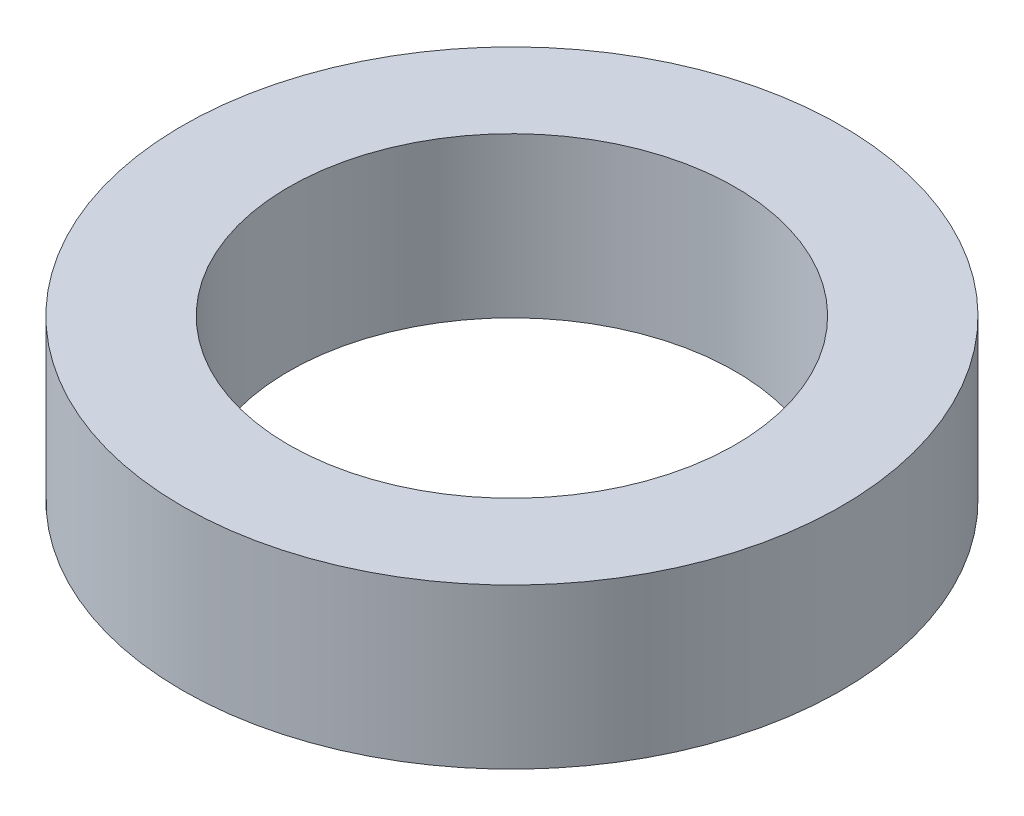
ISO-10303-21;
HEADER;
FILE_DESCRIPTION(('STEP AP214'),'2;1');
FILE_NAME('part.step','',(''),(''),'','','');
FILE_SCHEMA(('AUTOMOTIVE_DESIGN { 1 0 10303 214 1 1 1 1 }'));
ENDSEC;
DATA;
#1=APPLICATION_CONTEXT('core data for automotive mechanical design processes');
#2=APPLICATION_PROTOCOL_DEFINITION('international standard','automotive_design',2000,#1);
#3=PRODUCT_CONTEXT('',#1,'mechanical');
#4=PRODUCT('Part','Part','',(#3));
#5=PRODUCT_RELATED_PRODUCT_CATEGORY('part','',(#4));
#6=PRODUCT_DEFINITION_FORMATION('','',#4);
#7=PRODUCT_DEFINITION_CONTEXT('part definition',#1,'design');
#8=PRODUCT_DEFINITION('design','',#6,#7);
#9=PRODUCT_DEFINITION_SHAPE('','',#8);
#10=(LENGTH_UNIT() NAMED_UNIT(*) SI_UNIT(.MILLI.,.METRE.));
#11=(NAMED_UNIT(*) PLANE_ANGLE_UNIT() SI_UNIT($,.RADIAN.));
#12=(NAMED_UNIT(*) SI_UNIT($,.STERADIAN.) SOLID_ANGLE_UNIT());
#13=UNCERTAINTY_MEASURE_WITH_UNIT(LENGTH_MEASURE(1.E-05),#10,'distance_accuracy_value','');
#14=(GEOMETRIC_REPRESENTATION_CONTEXT(3) GLOBAL_UNCERTAINTY_ASSIGNED_CONTEXT((#13)) GLOBAL_UNIT_ASSIGNED_CONTEXT((#10,
#11,#12)) REPRESENTATION_CONTEXT('',''));
#15=CARTESIAN_POINT('',(0.,0.,0.));
#16=DIRECTION('',(0.,0.,1.));
#17=DIRECTION('',(1.,0.,0.));
#18=AXIS2_PLACEMENT_3D('',#15,#16,#17);
#19=CARTESIAN_POINT('',(0.,1.5,0.));
#20=DIRECTION('',(0.,1.,0.));
#21=DIRECTION('',(0.,0.,1.));
#22=AXIS2_PLACEMENT_3D('',#19,#20,#21);
#23=PLANE('',#22);
#24=CARTESIAN_POINT('',(0.,1.5,0.));
#25=DIRECTION('',(0.,1.,0.));
#26=DIRECTION('',(0.,0.,1.));
#27=AXIS2_PLACEMENT_3D('',#24,#25,#26);
#28=CIRCLE('',#27,3.1);
#29=CARTESIAN_POINT('',(0.,1.5,3.1));
#30=VERTEX_POINT('',#29);
#31=EDGE_CURVE('E10',#30,#30,#28,.T.);
#32=ORIENTED_EDGE('',*,*,#31,.T.);
#33=EDGE_LOOP('',(#32));
#34=FACE_BOUND('',#33,.T.);
#35=CARTESIAN_POINT('',(0.,1.5,0.));
#36=DIRECTION('',(0.,1.,0.));
#37=DIRECTION('',(0.,0.,1.));
#38=AXIS2_PLACEMENT_3D('',#35,#36,#37);
#39=CIRCLE('',#38,2.1);
#40=CARTESIAN_POINT('',(0.,1.5,2.1));
#41=VERTEX_POINT('',#40);
#42=EDGE_CURVE('E44',#41,#41,#39,.T.);
#43=ORIENTED_EDGE('',*,*,#42,.F.);
#44=EDGE_LOOP('',(#43));
#45=FACE_BOUND('',#44,.T.);
#46=ADVANCED_FACE('F33',(#34,#45),#23,.T.);
#47=CARTESIAN_POINT('',(0.,0.,0.));
#48=DIRECTION('',(0.,1.,0.));
#49=DIRECTION('',(0.,0.,1.));
#50=AXIS2_PLACEMENT_3D('',#47,#48,#49);
#51=PLANE('',#50);
#52=CARTESIAN_POINT('',(0.,0.,0.));
#53=DIRECTION('',(0.,1.,0.));
#54=DIRECTION('',(0.,0.,1.));
#55=AXIS2_PLACEMENT_3D('',#52,#53,#54);
#56=CIRCLE('',#55,3.1);
#57=CARTESIAN_POINT('',(0.,0.,3.1));
#58=VERTEX_POINT('',#57);
#59=EDGE_CURVE('E37',#58,#58,#56,.T.);
#60=ORIENTED_EDGE('',*,*,#59,.F.);
#61=EDGE_LOOP('',(#60));
#62=FACE_BOUND('',#61,.T.);
#63=CARTESIAN_POINT('',(0.,0.,0.));
#64=DIRECTION('',(0.,1.,0.));
#65=DIRECTION('',(0.,0.,1.));
#66=AXIS2_PLACEMENT_3D('',#63,#64,#65);
#67=CIRCLE('',#66,2.1);
#68=CARTESIAN_POINT('',(0.,0.,2.1));
#69=VERTEX_POINT('',#68);
#70=EDGE_CURVE('E46',#69,#69,#67,.T.);
#71=ORIENTED_EDGE('',*,*,#70,.T.);
#72=EDGE_LOOP('',(#71));
#73=FACE_BOUND('',#72,.T.);
#74=ADVANCED_FACE('F56',(#62,#73),#51,.F.);
#75=CARTESIAN_POINT('',(0.,1.5,0.));
#76=DIRECTION('',(0.,-1.,0.));
#77=DIRECTION('',(0.,0.,-1.));
#78=AXIS2_PLACEMENT_3D('',#75,#76,#77);
#79=CYLINDRICAL_SURFACE('',#78,3.1);
#80=ORIENTED_EDGE('',*,*,#31,.F.);
#81=EDGE_LOOP('',(#80));
#82=FACE_BOUND('',#81,.T.);
#83=ORIENTED_EDGE('',*,*,#59,.T.);
#84=EDGE_LOOP('',(#83));
#85=FACE_BOUND('',#84,.T.);
#86=ADVANCED_FACE('F35',(#82,#85),#79,.T.);
#87=CARTESIAN_POINT('',(0.,1.5,0.));
#88=DIRECTION('',(0.,-1.,0.));
#89=DIRECTION('',(0.,0.,-1.));
#90=AXIS2_PLACEMENT_3D('',#87,#88,#89);
#91=CYLINDRICAL_SURFACE('',#90,2.1);
#92=ORIENTED_EDGE('',*,*,#42,.T.);
#93=EDGE_LOOP('',(#92));
#94=FACE_BOUND('',#93,.T.);
#95=ORIENTED_EDGE('',*,*,#70,.F.);
#96=EDGE_LOOP('',(#95));
#97=FACE_BOUND('',#96,.T.);
#98=ADVANCED_FACE('F52',(#94,#97),#91,.F.);
#99=CLOSED_SHELL('',(#46,#74,#86,#98));
#100=MANIFOLD_SOLID_BREP('B2',#99);
#101=ADVANCED_BREP_SHAPE_REPRESENTATION('',(#18,#100),#14);
#102=SHAPE_DEFINITION_REPRESENTATION(#9,#101);
ENDSEC;
END-ISO-10303-21;
